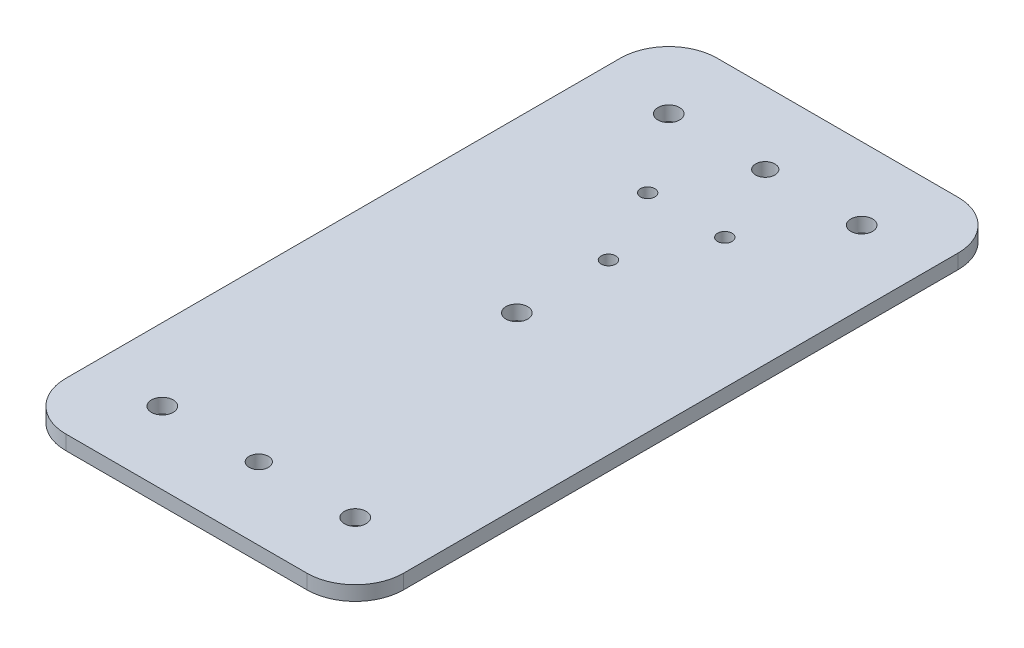
ISO-10303-21;
HEADER;
FILE_DESCRIPTION(('STEP AP214'),'2;1');
FILE_NAME('part.step','',(''),(''),'','','');
FILE_SCHEMA(('AUTOMOTIVE_DESIGN { 1 0 10303 214 1 1 1 1 }'));
ENDSEC;
DATA;
#1=APPLICATION_CONTEXT('core data for automotive mechanical design processes');
#2=APPLICATION_PROTOCOL_DEFINITION('international standard','automotive_design',2000,#1);
#3=PRODUCT_CONTEXT('',#1,'mechanical');
#4=PRODUCT('Part','Part','',(#3));
#5=PRODUCT_RELATED_PRODUCT_CATEGORY('part','',(#4));
#6=PRODUCT_DEFINITION_FORMATION('','',#4);
#7=PRODUCT_DEFINITION_CONTEXT('part definition',#1,'design');
#8=PRODUCT_DEFINITION('design','',#6,#7);
#9=PRODUCT_DEFINITION_SHAPE('','',#8);
#10=(LENGTH_UNIT() NAMED_UNIT(*) SI_UNIT(.MILLI.,.METRE.));
#11=(NAMED_UNIT(*) PLANE_ANGLE_UNIT() SI_UNIT($,.RADIAN.));
#12=(NAMED_UNIT(*) SI_UNIT($,.STERADIAN.) SOLID_ANGLE_UNIT());
#13=UNCERTAINTY_MEASURE_WITH_UNIT(LENGTH_MEASURE(1.E-05),#10,'distance_accuracy_value','');
#14=(GEOMETRIC_REPRESENTATION_CONTEXT(3) GLOBAL_UNCERTAINTY_ASSIGNED_CONTEXT((#13)) GLOBAL_UNIT_ASSIGNED_CONTEXT((#10,
#11,#12)) REPRESENTATION_CONTEXT('',''));
#15=CARTESIAN_POINT('',(0.,0.,0.));
#16=DIRECTION('',(0.,0.,1.));
#17=DIRECTION('',(1.,0.,0.));
#18=AXIS2_PLACEMENT_3D('',#15,#16,#17);
#19=CARTESIAN_POINT('',(0.,3.,0.));
#20=DIRECTION('',(1.,0.,0.));
#21=DIRECTION('',(0.,0.,-1.));
#22=AXIS2_PLACEMENT_3D('',#19,#20,#21);
#23=PLANE('',#22);
#24=DIRECTION('',(0.,0.,1.));
#25=VECTOR('',#24,1.);
#26=CARTESIAN_POINT('',(0.,0.,0.));
#27=LINE('',#26,#25);
#28=CARTESIAN_POINT('',(0.,0.,10.));
#29=VERTEX_POINT('',#28);
#30=CARTESIAN_POINT('',(0.,0.,125.));
#31=VERTEX_POINT('',#30);
#32=EDGE_CURVE('E141',#29,#31,#27,.T.);
#33=ORIENTED_EDGE('',*,*,#32,.T.);
#34=DIRECTION('',(0.,-1.,0.));
#35=VECTOR('',#34,1.);
#36=CARTESIAN_POINT('',(0.,3.,125.));
#37=LINE('',#36,#35);
#38=CARTESIAN_POINT('',(0.,3.,125.));
#39=VERTEX_POINT('',#38);
#40=EDGE_CURVE('E175',#31,#39,#37,.F.);
#41=ORIENTED_EDGE('',*,*,#40,.T.);
#42=DIRECTION('',(0.,0.,1.));
#43=VECTOR('',#42,1.);
#44=CARTESIAN_POINT('',(0.,3.,0.));
#45=LINE('',#44,#43);
#46=CARTESIAN_POINT('',(0.,3.,10.));
#47=VERTEX_POINT('',#46);
#48=EDGE_CURVE('E139',#47,#39,#45,.T.);
#49=ORIENTED_EDGE('',*,*,#48,.F.);
#50=DIRECTION('',(0.,-1.,0.));
#51=VECTOR('',#50,1.);
#52=CARTESIAN_POINT('',(0.,3.,10.));
#53=LINE('',#52,#51);
#54=EDGE_CURVE('E171',#47,#29,#53,.T.);
#55=ORIENTED_EDGE('',*,*,#54,.T.);
#56=EDGE_LOOP('',(#33,#41,#49,#55));
#57=FACE_BOUND('',#56,.T.);
#58=ADVANCED_FACE('F39',(#57),#23,.F.);
#59=CARTESIAN_POINT('',(0.,3.,135.));
#60=DIRECTION('',(0.,0.,-1.));
#61=DIRECTION('',(-1.,0.,0.));
#62=AXIS2_PLACEMENT_3D('',#59,#60,#61);
#63=PLANE('',#62);
#64=DIRECTION('',(1.,0.,0.));
#65=VECTOR('',#64,1.);
#66=CARTESIAN_POINT('',(0.,0.,135.));
#67=LINE('',#66,#65);
#68=CARTESIAN_POINT('',(10.,0.,135.));
#69=VERTEX_POINT('',#68);
#70=CARTESIAN_POINT('',(60.,0.,135.));
#71=VERTEX_POINT('',#70);
#72=EDGE_CURVE('E134',#69,#71,#67,.T.);
#73=ORIENTED_EDGE('',*,*,#72,.T.);
#74=DIRECTION('',(0.,-1.,0.));
#75=VECTOR('',#74,1.);
#76=CARTESIAN_POINT('',(60.,3.,135.));
#77=LINE('',#76,#75);
#78=CARTESIAN_POINT('',(60.,3.,135.));
#79=VERTEX_POINT('',#78);
#80=EDGE_CURVE('E110',#71,#79,#77,.F.);
#81=ORIENTED_EDGE('',*,*,#80,.T.);
#82=DIRECTION('',(1.,0.,0.));
#83=VECTOR('',#82,1.);
#84=CARTESIAN_POINT('',(0.,3.,135.));
#85=LINE('',#84,#83);
#86=CARTESIAN_POINT('',(10.,3.,135.));
#87=VERTEX_POINT('',#86);
#88=EDGE_CURVE('E195',#87,#79,#85,.T.);
#89=ORIENTED_EDGE('',*,*,#88,.F.);
#90=DIRECTION('',(0.,-1.,0.));
#91=VECTOR('',#90,1.);
#92=CARTESIAN_POINT('',(10.,3.,135.));
#93=LINE('',#92,#91);
#94=EDGE_CURVE('E116',#87,#69,#93,.T.);
#95=ORIENTED_EDGE('',*,*,#94,.T.);
#96=EDGE_LOOP('',(#73,#81,#89,#95));
#97=FACE_BOUND('',#96,.T.);
#98=ADVANCED_FACE('F336',(#97),#63,.F.);
#99=CARTESIAN_POINT('',(70.,3.,0.));
#100=DIRECTION('',(-1.,0.,0.));
#101=DIRECTION('',(0.,0.,1.));
#102=AXIS2_PLACEMENT_3D('',#99,#100,#101);
#103=PLANE('',#102);
#104=DIRECTION('',(0.,0.,-1.));
#105=VECTOR('',#104,1.);
#106=CARTESIAN_POINT('',(70.,3.,0.));
#107=LINE('',#106,#105);
#108=CARTESIAN_POINT('',(70.,3.,125.));
#109=VERTEX_POINT('',#108);
#110=CARTESIAN_POINT('',(70.,3.,10.));
#111=VERTEX_POINT('',#110);
#112=EDGE_CURVE('E125',#109,#111,#107,.T.);
#113=ORIENTED_EDGE('',*,*,#112,.F.);
#114=DIRECTION('',(0.,-1.,0.));
#115=VECTOR('',#114,1.);
#116=CARTESIAN_POINT('',(70.,3.,125.));
#117=LINE('',#116,#115);
#118=CARTESIAN_POINT('',(70.,0.,125.));
#119=VERTEX_POINT('',#118);
#120=EDGE_CURVE('E109',#109,#119,#117,.T.);
#121=ORIENTED_EDGE('',*,*,#120,.T.);
#122=DIRECTION('',(0.,0.,-1.));
#123=VECTOR('',#122,1.);
#124=CARTESIAN_POINT('',(70.,0.,0.));
#125=LINE('',#124,#123);
#126=CARTESIAN_POINT('',(70.,0.,10.));
#127=VERTEX_POINT('',#126);
#128=EDGE_CURVE('E123',#119,#127,#125,.T.);
#129=ORIENTED_EDGE('',*,*,#128,.T.);
#130=DIRECTION('',(0.,-1.,0.));
#131=VECTOR('',#130,1.);
#132=CARTESIAN_POINT('',(70.,3.,10.));
#133=LINE('',#132,#131);
#134=EDGE_CURVE('E128',#127,#111,#133,.F.);
#135=ORIENTED_EDGE('',*,*,#134,.T.);
#136=EDGE_LOOP('',(#113,#121,#129,#135));
#137=FACE_BOUND('',#136,.T.);
#138=ADVANCED_FACE('F122',(#137),#103,.F.);
#139=CARTESIAN_POINT('',(0.,3.,0.));
#140=DIRECTION('',(0.,0.,1.));
#141=DIRECTION('',(1.,0.,0.));
#142=AXIS2_PLACEMENT_3D('',#139,#140,#141);
#143=PLANE('',#142);
#144=DIRECTION('',(-1.,0.,0.));
#145=VECTOR('',#144,1.);
#146=CARTESIAN_POINT('',(0.,0.,0.));
#147=LINE('',#146,#145);
#148=CARTESIAN_POINT('',(60.,0.,0.));
#149=VERTEX_POINT('',#148);
#150=CARTESIAN_POINT('',(10.,0.,0.));
#151=VERTEX_POINT('',#150);
#152=EDGE_CURVE('E133',#149,#151,#147,.T.);
#153=ORIENTED_EDGE('',*,*,#152,.T.);
#154=DIRECTION('',(0.,-1.,0.));
#155=VECTOR('',#154,1.);
#156=CARTESIAN_POINT('',(10.,3.,0.));
#157=LINE('',#156,#155);
#158=CARTESIAN_POINT('',(10.,3.,0.));
#159=VERTEX_POINT('',#158);
#160=EDGE_CURVE('E11',#151,#159,#157,.F.);
#161=ORIENTED_EDGE('',*,*,#160,.T.);
#162=DIRECTION('',(-1.,0.,0.));
#163=VECTOR('',#162,1.);
#164=CARTESIAN_POINT('',(0.,3.,0.));
#165=LINE('',#164,#163);
#166=CARTESIAN_POINT('',(60.,3.,0.));
#167=VERTEX_POINT('',#166);
#168=EDGE_CURVE('E146',#167,#159,#165,.T.);
#169=ORIENTED_EDGE('',*,*,#168,.F.);
#170=DIRECTION('',(0.,-1.,0.));
#171=VECTOR('',#170,1.);
#172=CARTESIAN_POINT('',(60.,3.,0.));
#173=LINE('',#172,#171);
#174=EDGE_CURVE('E48',#167,#149,#173,.T.);
#175=ORIENTED_EDGE('',*,*,#174,.T.);
#176=EDGE_LOOP('',(#153,#161,#169,#175));
#177=FACE_BOUND('',#176,.T.);
#178=ADVANCED_FACE('F181',(#177),#143,.F.);
#179=CARTESIAN_POINT('',(0.,3.,0.));
#180=DIRECTION('',(0.,1.,0.));
#181=DIRECTION('',(0.,0.,1.));
#182=AXIS2_PLACEMENT_3D('',#179,#180,#181);
#183=PLANE('',#182);
#184=CARTESIAN_POINT('',(35.,3.,66.5));
#185=DIRECTION('',(0.,-1.,0.));
#186=DIRECTION('',(0.,0.,-1.));
#187=AXIS2_PLACEMENT_3D('',#184,#185,#186);
#188=CIRCLE('',#187,2.25000000009542);
#189=CARTESIAN_POINT('',(35.,3.,64.2499999999045));
#190=VERTEX_POINT('',#189);
#191=EDGE_CURVE('E272',#190,#190,#188,.T.);
#192=ORIENTED_EDGE('',*,*,#191,.T.);
#193=EDGE_LOOP('',(#192));
#194=FACE_BOUND('',#193,.T.);
#195=CARTESIAN_POINT('',(27.,3.,31.3754845034029));
#196=DIRECTION('',(0.,-1.,0.));
#197=DIRECTION('',(0.,0.,-1.));
#198=AXIS2_PLACEMENT_3D('',#195,#196,#197);
#199=CIRCLE('',#198,1.5);
#200=CARTESIAN_POINT('',(27.,3.,29.8754845034029));
#201=VERTEX_POINT('',#200);
#202=EDGE_CURVE('E280',#201,#201,#199,.T.);
#203=ORIENTED_EDGE('',*,*,#202,.T.);
#204=EDGE_LOOP('',(#203));
#205=FACE_BOUND('',#204,.T.);
#206=CARTESIAN_POINT('',(43.,3.,31.3754845034029));
#207=DIRECTION('',(0.,-1.,0.));
#208=DIRECTION('',(0.,0.,-1.));
#209=AXIS2_PLACEMENT_3D('',#206,#207,#208);
#210=CIRCLE('',#209,1.5);
#211=CARTESIAN_POINT('',(43.,3.,29.8754845034029));
#212=VERTEX_POINT('',#211);
#213=EDGE_CURVE('E264',#212,#212,#210,.T.);
#214=ORIENTED_EDGE('',*,*,#213,.T.);
#215=EDGE_LOOP('',(#214));
#216=FACE_BOUND('',#215,.T.);
#217=CARTESIAN_POINT('',(35.,3.,47.5));
#218=DIRECTION('',(0.,-1.,0.));
#219=DIRECTION('',(0.,0.,-1.));
#220=AXIS2_PLACEMENT_3D('',#217,#218,#219);
#221=CIRCLE('',#220,1.50000000009542);
#222=CARTESIAN_POINT('',(35.,3.,45.9999999999045));
#223=VERTEX_POINT('',#222);
#224=EDGE_CURVE('E256',#223,#223,#221,.T.);
#225=ORIENTED_EDGE('',*,*,#224,.T.);
#226=EDGE_LOOP('',(#225));
#227=FACE_BOUND('',#226,.T.);
#228=CARTESIAN_POINT('',(35.,3.,120.));
#229=DIRECTION('',(0.,1.,0.));
#230=DIRECTION('',(0.,0.,1.));
#231=AXIS2_PLACEMENT_3D('',#228,#229,#230);
#232=CIRCLE('',#231,2.);
#233=CARTESIAN_POINT('',(35.,3.,122.));
#234=VERTEX_POINT('',#233);
#235=EDGE_CURVE('E236',#234,#234,#232,.T.);
#236=ORIENTED_EDGE('',*,*,#235,.F.);
#237=EDGE_LOOP('',(#236));
#238=FACE_BOUND('',#237,.T.);
#239=CARTESIAN_POINT('',(55.,3.,120.));
#240=DIRECTION('',(0.,1.,0.));
#241=DIRECTION('',(0.,0.,1.));
#242=AXIS2_PLACEMENT_3D('',#239,#240,#241);
#243=CIRCLE('',#242,2.25);
#244=CARTESIAN_POINT('',(55.,3.,122.25));
#245=VERTEX_POINT('',#244);
#246=EDGE_CURVE('E245',#245,#245,#243,.T.);
#247=ORIENTED_EDGE('',*,*,#246,.F.);
#248=EDGE_LOOP('',(#247));
#249=FACE_BOUND('',#248,.T.);
#250=CARTESIAN_POINT('',(15.,3.,120.));
#251=DIRECTION('',(0.,1.,0.));
#252=DIRECTION('',(0.,0.,1.));
#253=AXIS2_PLACEMENT_3D('',#250,#251,#252);
#254=CIRCLE('',#253,2.25);
#255=CARTESIAN_POINT('',(15.,3.,122.25));
#256=VERTEX_POINT('',#255);
#257=EDGE_CURVE('E220',#256,#256,#254,.T.);
#258=ORIENTED_EDGE('',*,*,#257,.F.);
#259=EDGE_LOOP('',(#258));
#260=FACE_BOUND('',#259,.T.);
#261=CARTESIAN_POINT('',(55.,3.,15.));
#262=DIRECTION('',(0.,1.,0.));
#263=DIRECTION('',(0.,0.,1.));
#264=AXIS2_PLACEMENT_3D('',#261,#262,#263);
#265=CIRCLE('',#264,2.25);
#266=CARTESIAN_POINT('',(55.,3.,17.25));
#267=VERTEX_POINT('',#266);
#268=EDGE_CURVE('E229',#267,#267,#265,.T.);
#269=ORIENTED_EDGE('',*,*,#268,.F.);
#270=EDGE_LOOP('',(#269));
#271=FACE_BOUND('',#270,.T.);
#272=CARTESIAN_POINT('',(35.,3.,15.));
#273=DIRECTION('',(0.,1.,0.));
#274=DIRECTION('',(0.,0.,1.));
#275=AXIS2_PLACEMENT_3D('',#272,#273,#274);
#276=CIRCLE('',#275,2.);
#277=CARTESIAN_POINT('',(35.,3.,17.));
#278=VERTEX_POINT('',#277);
#279=EDGE_CURVE('E252',#278,#278,#276,.T.);
#280=ORIENTED_EDGE('',*,*,#279,.F.);
#281=EDGE_LOOP('',(#280));
#282=FACE_BOUND('',#281,.T.);
#283=CARTESIAN_POINT('',(15.,3.,15.));
#284=DIRECTION('',(0.,1.,0.));
#285=DIRECTION('',(0.,0.,1.));
#286=AXIS2_PLACEMENT_3D('',#283,#284,#285);
#287=CIRCLE('',#286,2.25);
#288=CARTESIAN_POINT('',(15.,3.,17.25));
#289=VERTEX_POINT('',#288);
#290=EDGE_CURVE('E202',#289,#289,#287,.T.);
#291=ORIENTED_EDGE('',*,*,#290,.F.);
#292=EDGE_LOOP('',(#291));
#293=FACE_BOUND('',#292,.T.);
#294=ORIENTED_EDGE('',*,*,#88,.T.);
#295=CARTESIAN_POINT('',(60.,3.,125.));
#296=DIRECTION('',(0.,1.,0.));
#297=DIRECTION('',(0.,0.,1.));
#298=AXIS2_PLACEMENT_3D('',#295,#296,#297);
#299=CIRCLE('',#298,10.);
#300=EDGE_CURVE('E168',#79,#109,#299,.T.);
#301=ORIENTED_EDGE('',*,*,#300,.T.);
#302=ORIENTED_EDGE('',*,*,#112,.T.);
#303=CARTESIAN_POINT('',(60.,3.,10.));
#304=DIRECTION('',(0.,1.,0.));
#305=DIRECTION('',(0.,0.,1.));
#306=AXIS2_PLACEMENT_3D('',#303,#304,#305);
#307=CIRCLE('',#306,10.);
#308=EDGE_CURVE('E60',#111,#167,#307,.T.);
#309=ORIENTED_EDGE('',*,*,#308,.T.);
#310=ORIENTED_EDGE('',*,*,#168,.T.);
#311=CARTESIAN_POINT('',(10.,3.,10.));
#312=DIRECTION('',(0.,1.,0.));
#313=DIRECTION('',(0.,0.,1.));
#314=AXIS2_PLACEMENT_3D('',#311,#312,#313);
#315=CIRCLE('',#314,10.);
#316=EDGE_CURVE('E162',#159,#47,#315,.T.);
#317=ORIENTED_EDGE('',*,*,#316,.T.);
#318=ORIENTED_EDGE('',*,*,#48,.T.);
#319=CARTESIAN_POINT('',(10.,3.,125.));
#320=DIRECTION('',(0.,1.,0.));
#321=DIRECTION('',(0.,0.,1.));
#322=AXIS2_PLACEMENT_3D('',#319,#320,#321);
#323=CIRCLE('',#322,10.);
#324=EDGE_CURVE('E165',#39,#87,#323,.T.);
#325=ORIENTED_EDGE('',*,*,#324,.T.);
#326=EDGE_LOOP('',(#294,#301,#302,#309,#310,#317,#318,#325));
#327=FACE_BOUND('',#326,.T.);
#328=ADVANCED_FACE('F293',(#194,#205,#216,#227,#238,#249,#260,#271,#282,#293,#327),#183,.T.);
#329=CARTESIAN_POINT('',(0.,0.,0.));
#330=DIRECTION('',(0.,1.,0.));
#331=DIRECTION('',(0.,0.,1.));
#332=AXIS2_PLACEMENT_3D('',#329,#330,#331);
#333=PLANE('',#332);
#334=CARTESIAN_POINT('',(35.,0.,66.5));
#335=DIRECTION('',(0.,-1.,0.));
#336=DIRECTION('',(0.,0.,-1.));
#337=AXIS2_PLACEMENT_3D('',#334,#335,#336);
#338=CIRCLE('',#337,2.25000000009542);
#339=CARTESIAN_POINT('',(35.,0.,64.2499999999045));
#340=VERTEX_POINT('',#339);
#341=EDGE_CURVE('E268',#340,#340,#338,.T.);
#342=ORIENTED_EDGE('',*,*,#341,.F.);
#343=EDGE_LOOP('',(#342));
#344=FACE_BOUND('',#343,.T.);
#345=CARTESIAN_POINT('',(27.,0.,31.3754845034029));
#346=DIRECTION('',(0.,-1.,0.));
#347=DIRECTION('',(0.,0.,-1.));
#348=AXIS2_PLACEMENT_3D('',#345,#346,#347);
#349=CIRCLE('',#348,1.5);
#350=CARTESIAN_POINT('',(27.,0.,29.8754845034029));
#351=VERTEX_POINT('',#350);
#352=EDGE_CURVE('E276',#351,#351,#349,.T.);
#353=ORIENTED_EDGE('',*,*,#352,.F.);
#354=EDGE_LOOP('',(#353));
#355=FACE_BOUND('',#354,.T.);
#356=CARTESIAN_POINT('',(43.,0.,31.3754845034029));
#357=DIRECTION('',(0.,-1.,0.));
#358=DIRECTION('',(0.,0.,-1.));
#359=AXIS2_PLACEMENT_3D('',#356,#357,#358);
#360=CIRCLE('',#359,1.5);
#361=CARTESIAN_POINT('',(43.,0.,29.8754845034029));
#362=VERTEX_POINT('',#361);
#363=EDGE_CURVE('E284',#362,#362,#360,.T.);
#364=ORIENTED_EDGE('',*,*,#363,.F.);
#365=EDGE_LOOP('',(#364));
#366=FACE_BOUND('',#365,.T.);
#367=CARTESIAN_POINT('',(35.,0.,47.5));
#368=DIRECTION('',(0.,-1.,0.));
#369=DIRECTION('',(0.,0.,-1.));
#370=AXIS2_PLACEMENT_3D('',#367,#368,#369);
#371=CIRCLE('',#370,1.50000000009542);
#372=CARTESIAN_POINT('',(35.,0.,45.9999999999045));
#373=VERTEX_POINT('',#372);
#374=EDGE_CURVE('E260',#373,#373,#371,.T.);
#375=ORIENTED_EDGE('',*,*,#374,.F.);
#376=EDGE_LOOP('',(#375));
#377=FACE_BOUND('',#376,.T.);
#378=CARTESIAN_POINT('',(35.,0.,120.));
#379=DIRECTION('',(0.,1.,0.));
#380=DIRECTION('',(0.,0.,1.));
#381=AXIS2_PLACEMENT_3D('',#378,#379,#380);
#382=CIRCLE('',#381,2.);
#383=CARTESIAN_POINT('',(35.,0.,122.));
#384=VERTEX_POINT('',#383);
#385=EDGE_CURVE('E240',#384,#384,#382,.T.);
#386=ORIENTED_EDGE('',*,*,#385,.T.);
#387=EDGE_LOOP('',(#386));
#388=FACE_BOUND('',#387,.T.);
#389=CARTESIAN_POINT('',(55.,0.,120.));
#390=DIRECTION('',(0.,1.,0.));
#391=DIRECTION('',(0.,0.,1.));
#392=AXIS2_PLACEMENT_3D('',#389,#390,#391);
#393=CIRCLE('',#392,2.25);
#394=CARTESIAN_POINT('',(55.,0.,122.25));
#395=VERTEX_POINT('',#394);
#396=EDGE_CURVE('E225',#395,#395,#393,.T.);
#397=ORIENTED_EDGE('',*,*,#396,.T.);
#398=EDGE_LOOP('',(#397));
#399=FACE_BOUND('',#398,.T.);
#400=CARTESIAN_POINT('',(15.,0.,120.));
#401=DIRECTION('',(0.,1.,0.));
#402=DIRECTION('',(0.,0.,1.));
#403=AXIS2_PLACEMENT_3D('',#400,#401,#402);
#404=CIRCLE('',#403,2.25);
#405=CARTESIAN_POINT('',(15.,0.,122.25));
#406=VERTEX_POINT('',#405);
#407=EDGE_CURVE('E224',#406,#406,#404,.T.);
#408=ORIENTED_EDGE('',*,*,#407,.T.);
#409=EDGE_LOOP('',(#408));
#410=FACE_BOUND('',#409,.T.);
#411=CARTESIAN_POINT('',(55.,0.,15.));
#412=DIRECTION('',(0.,1.,0.));
#413=DIRECTION('',(0.,0.,1.));
#414=AXIS2_PLACEMENT_3D('',#411,#412,#413);
#415=CIRCLE('',#414,2.25);
#416=CARTESIAN_POINT('',(55.,0.,17.25));
#417=VERTEX_POINT('',#416);
#418=EDGE_CURVE('E218',#417,#417,#415,.T.);
#419=ORIENTED_EDGE('',*,*,#418,.T.);
#420=EDGE_LOOP('',(#419));
#421=FACE_BOUND('',#420,.T.);
#422=CARTESIAN_POINT('',(35.,0.,15.));
#423=DIRECTION('',(0.,1.,0.));
#424=DIRECTION('',(0.,0.,1.));
#425=AXIS2_PLACEMENT_3D('',#422,#423,#424);
#426=CIRCLE('',#425,2.);
#427=CARTESIAN_POINT('',(35.,0.,17.));
#428=VERTEX_POINT('',#427);
#429=EDGE_CURVE('E241',#428,#428,#426,.T.);
#430=ORIENTED_EDGE('',*,*,#429,.T.);
#431=EDGE_LOOP('',(#430));
#432=FACE_BOUND('',#431,.T.);
#433=CARTESIAN_POINT('',(15.,0.,15.));
#434=DIRECTION('',(0.,1.,0.));
#435=DIRECTION('',(0.,0.,1.));
#436=AXIS2_PLACEMENT_3D('',#433,#434,#435);
#437=CIRCLE('',#436,2.25);
#438=CARTESIAN_POINT('',(15.,0.,17.25));
#439=VERTEX_POINT('',#438);
#440=EDGE_CURVE('E209',#439,#439,#437,.T.);
#441=ORIENTED_EDGE('',*,*,#440,.T.);
#442=EDGE_LOOP('',(#441));
#443=FACE_BOUND('',#442,.T.);
#444=ORIENTED_EDGE('',*,*,#128,.F.);
#445=CARTESIAN_POINT('',(60.,0.,125.));
#446=DIRECTION('',(0.,1.,0.));
#447=DIRECTION('',(0.,0.,1.));
#448=AXIS2_PLACEMENT_3D('',#445,#446,#447);
#449=CIRCLE('',#448,10.);
#450=EDGE_CURVE('E105',#119,#71,#449,.F.);
#451=ORIENTED_EDGE('',*,*,#450,.T.);
#452=ORIENTED_EDGE('',*,*,#72,.F.);
#453=CARTESIAN_POINT('',(10.,0.,125.));
#454=DIRECTION('',(0.,1.,0.));
#455=DIRECTION('',(0.,0.,1.));
#456=AXIS2_PLACEMENT_3D('',#453,#454,#455);
#457=CIRCLE('',#456,10.);
#458=EDGE_CURVE('E117',#69,#31,#457,.F.);
#459=ORIENTED_EDGE('',*,*,#458,.T.);
#460=ORIENTED_EDGE('',*,*,#32,.F.);
#461=CARTESIAN_POINT('',(10.,0.,10.));
#462=DIRECTION('',(0.,1.,0.));
#463=DIRECTION('',(0.,0.,1.));
#464=AXIS2_PLACEMENT_3D('',#461,#462,#463);
#465=CIRCLE('',#464,10.);
#466=EDGE_CURVE('E150',#29,#151,#465,.F.);
#467=ORIENTED_EDGE('',*,*,#466,.T.);
#468=ORIENTED_EDGE('',*,*,#152,.F.);
#469=CARTESIAN_POINT('',(60.,0.,10.));
#470=DIRECTION('',(0.,1.,0.));
#471=DIRECTION('',(0.,0.,1.));
#472=AXIS2_PLACEMENT_3D('',#469,#470,#471);
#473=CIRCLE('',#472,10.);
#474=EDGE_CURVE('E127',#149,#127,#473,.F.);
#475=ORIENTED_EDGE('',*,*,#474,.T.);
#476=EDGE_LOOP('',(#444,#451,#452,#459,#460,#467,#468,#475));
#477=FACE_BOUND('',#476,.T.);
#478=ADVANCED_FACE('F130',(#344,#355,#366,#377,#388,#399,#410,#421,#432,#443,#477),#333,.F.);
#479=CARTESIAN_POINT('',(15.,0.,15.));
#480=DIRECTION('',(0.,1.,0.));
#481=DIRECTION('',(0.,0.,1.));
#482=AXIS2_PLACEMENT_3D('',#479,#480,#481);
#483=CYLINDRICAL_SURFACE('',#482,2.25);
#484=ORIENTED_EDGE('',*,*,#440,.F.);
#485=EDGE_LOOP('',(#484));
#486=FACE_BOUND('',#485,.T.);
#487=ORIENTED_EDGE('',*,*,#290,.T.);
#488=EDGE_LOOP('',(#487));
#489=FACE_BOUND('',#488,.T.);
#490=ADVANCED_FACE('F306',(#486,#489),#483,.F.);
#491=CARTESIAN_POINT('',(35.,0.,15.));
#492=DIRECTION('',(0.,1.,0.));
#493=DIRECTION('',(0.,0.,1.));
#494=AXIS2_PLACEMENT_3D('',#491,#492,#493);
#495=CYLINDRICAL_SURFACE('',#494,2.);
#496=ORIENTED_EDGE('',*,*,#429,.F.);
#497=EDGE_LOOP('',(#496));
#498=FACE_BOUND('',#497,.T.);
#499=ORIENTED_EDGE('',*,*,#279,.T.);
#500=EDGE_LOOP('',(#499));
#501=FACE_BOUND('',#500,.T.);
#502=ADVANCED_FACE('F321',(#498,#501),#495,.F.);
#503=CARTESIAN_POINT('',(55.,0.,15.));
#504=DIRECTION('',(0.,1.,0.));
#505=DIRECTION('',(0.,0.,1.));
#506=AXIS2_PLACEMENT_3D('',#503,#504,#505);
#507=CYLINDRICAL_SURFACE('',#506,2.25);
#508=ORIENTED_EDGE('',*,*,#418,.F.);
#509=EDGE_LOOP('',(#508));
#510=FACE_BOUND('',#509,.T.);
#511=ORIENTED_EDGE('',*,*,#268,.T.);
#512=EDGE_LOOP('',(#511));
#513=FACE_BOUND('',#512,.T.);
#514=ADVANCED_FACE('F324',(#510,#513),#507,.F.);
#515=CARTESIAN_POINT('',(15.,0.,120.));
#516=DIRECTION('',(0.,1.,0.));
#517=DIRECTION('',(0.,0.,1.));
#518=AXIS2_PLACEMENT_3D('',#515,#516,#517);
#519=CYLINDRICAL_SURFACE('',#518,2.25);
#520=ORIENTED_EDGE('',*,*,#407,.F.);
#521=EDGE_LOOP('',(#520));
#522=FACE_BOUND('',#521,.T.);
#523=ORIENTED_EDGE('',*,*,#257,.T.);
#524=EDGE_LOOP('',(#523));
#525=FACE_BOUND('',#524,.T.);
#526=ADVANCED_FACE('F361',(#522,#525),#519,.F.);
#527=CARTESIAN_POINT('',(55.,0.,120.));
#528=DIRECTION('',(0.,1.,0.));
#529=DIRECTION('',(0.,0.,1.));
#530=AXIS2_PLACEMENT_3D('',#527,#528,#529);
#531=CYLINDRICAL_SURFACE('',#530,2.25);
#532=ORIENTED_EDGE('',*,*,#396,.F.);
#533=EDGE_LOOP('',(#532));
#534=FACE_BOUND('',#533,.T.);
#535=ORIENTED_EDGE('',*,*,#246,.T.);
#536=EDGE_LOOP('',(#535));
#537=FACE_BOUND('',#536,.T.);
#538=ADVANCED_FACE('F364',(#534,#537),#531,.F.);
#539=CARTESIAN_POINT('',(35.,0.,120.));
#540=DIRECTION('',(0.,1.,0.));
#541=DIRECTION('',(0.,0.,1.));
#542=AXIS2_PLACEMENT_3D('',#539,#540,#541);
#543=CYLINDRICAL_SURFACE('',#542,2.);
#544=ORIENTED_EDGE('',*,*,#385,.F.);
#545=EDGE_LOOP('',(#544));
#546=FACE_BOUND('',#545,.T.);
#547=ORIENTED_EDGE('',*,*,#235,.T.);
#548=EDGE_LOOP('',(#547));
#549=FACE_BOUND('',#548,.T.);
#550=ADVANCED_FACE('F345',(#546,#549),#543,.F.);
#551=CARTESIAN_POINT('',(60.,3.,125.));
#552=DIRECTION('',(0.,-1.,0.));
#553=DIRECTION('',(0.,0.,-1.));
#554=AXIS2_PLACEMENT_3D('',#551,#552,#553);
#555=CYLINDRICAL_SURFACE('',#554,10.);
#556=ORIENTED_EDGE('',*,*,#300,.F.);
#557=ORIENTED_EDGE('',*,*,#80,.F.);
#558=ORIENTED_EDGE('',*,*,#450,.F.);
#559=ORIENTED_EDGE('',*,*,#120,.F.);
#560=EDGE_LOOP('',(#556,#557,#558,#559));
#561=FACE_BOUND('',#560,.T.);
#562=ADVANCED_FACE('F108',(#561),#555,.T.);
#563=CARTESIAN_POINT('',(10.,3.,125.));
#564=DIRECTION('',(0.,-1.,0.));
#565=DIRECTION('',(0.,0.,-1.));
#566=AXIS2_PLACEMENT_3D('',#563,#564,#565);
#567=CYLINDRICAL_SURFACE('',#566,10.);
#568=ORIENTED_EDGE('',*,*,#324,.F.);
#569=ORIENTED_EDGE('',*,*,#40,.F.);
#570=ORIENTED_EDGE('',*,*,#458,.F.);
#571=ORIENTED_EDGE('',*,*,#94,.F.);
#572=EDGE_LOOP('',(#568,#569,#570,#571));
#573=FACE_BOUND('',#572,.T.);
#574=ADVANCED_FACE('F338',(#573),#567,.T.);
#575=CARTESIAN_POINT('',(10.,3.,10.));
#576=DIRECTION('',(0.,-1.,0.));
#577=DIRECTION('',(0.,0.,-1.));
#578=AXIS2_PLACEMENT_3D('',#575,#576,#577);
#579=CYLINDRICAL_SURFACE('',#578,10.);
#580=ORIENTED_EDGE('',*,*,#316,.F.);
#581=ORIENTED_EDGE('',*,*,#160,.F.);
#582=ORIENTED_EDGE('',*,*,#466,.F.);
#583=ORIENTED_EDGE('',*,*,#54,.F.);
#584=EDGE_LOOP('',(#580,#581,#582,#583));
#585=FACE_BOUND('',#584,.T.);
#586=ADVANCED_FACE('F188',(#585),#579,.T.);
#587=CARTESIAN_POINT('',(60.,3.,10.));
#588=DIRECTION('',(0.,-1.,0.));
#589=DIRECTION('',(0.,0.,-1.));
#590=AXIS2_PLACEMENT_3D('',#587,#588,#589);
#591=CYLINDRICAL_SURFACE('',#590,10.);
#592=ORIENTED_EDGE('',*,*,#308,.F.);
#593=ORIENTED_EDGE('',*,*,#134,.F.);
#594=ORIENTED_EDGE('',*,*,#474,.F.);
#595=ORIENTED_EDGE('',*,*,#174,.F.);
#596=EDGE_LOOP('',(#592,#593,#594,#595));
#597=FACE_BOUND('',#596,.T.);
#598=ADVANCED_FACE('F41',(#597),#591,.T.);
#599=CARTESIAN_POINT('',(35.,3.,47.5));
#600=DIRECTION('',(0.,-1.,0.));
#601=DIRECTION('',(0.,0.,-1.));
#602=AXIS2_PLACEMENT_3D('',#599,#600,#601);
#603=CYLINDRICAL_SURFACE('',#602,1.50000000009542);
#604=ORIENTED_EDGE('',*,*,#224,.F.);
#605=EDGE_LOOP('',(#604));
#606=FACE_BOUND('',#605,.T.);
#607=ORIENTED_EDGE('',*,*,#374,.T.);
#608=EDGE_LOOP('',(#607));
#609=FACE_BOUND('',#608,.T.);
#610=ADVANCED_FACE('F300',(#606,#609),#603,.F.);
#611=CARTESIAN_POINT('',(43.,3.,31.3754845034029));
#612=DIRECTION('',(0.,-1.,0.));
#613=DIRECTION('',(0.,0.,-1.));
#614=AXIS2_PLACEMENT_3D('',#611,#612,#613);
#615=CYLINDRICAL_SURFACE('',#614,1.5);
#616=ORIENTED_EDGE('',*,*,#213,.F.);
#617=EDGE_LOOP('',(#616));
#618=FACE_BOUND('',#617,.T.);
#619=ORIENTED_EDGE('',*,*,#363,.T.);
#620=EDGE_LOOP('',(#619));
#621=FACE_BOUND('',#620,.T.);
#622=ADVANCED_FACE('F296',(#618,#621),#615,.F.);
#623=CARTESIAN_POINT('',(27.,3.,31.3754845034029));
#624=DIRECTION('',(0.,-1.,0.));
#625=DIRECTION('',(0.,0.,-1.));
#626=AXIS2_PLACEMENT_3D('',#623,#624,#625);
#627=CYLINDRICAL_SURFACE('',#626,1.5);
#628=ORIENTED_EDGE('',*,*,#202,.F.);
#629=EDGE_LOOP('',(#628));
#630=FACE_BOUND('',#629,.T.);
#631=ORIENTED_EDGE('',*,*,#352,.T.);
#632=EDGE_LOOP('',(#631));
#633=FACE_BOUND('',#632,.T.);
#634=ADVANCED_FACE('F299',(#630,#633),#627,.F.);
#635=CARTESIAN_POINT('',(35.,3.,66.5));
#636=DIRECTION('',(0.,-1.,0.));
#637=DIRECTION('',(0.,0.,-1.));
#638=AXIS2_PLACEMENT_3D('',#635,#636,#637);
#639=CYLINDRICAL_SURFACE('',#638,2.25000000009542);
#640=ORIENTED_EDGE('',*,*,#191,.F.);
#641=EDGE_LOOP('',(#640));
#642=FACE_BOUND('',#641,.T.);
#643=ORIENTED_EDGE('',*,*,#341,.T.);
#644=EDGE_LOOP('',(#643));
#645=FACE_BOUND('',#644,.T.);
#646=ADVANCED_FACE('F378',(#642,#645),#639,.F.);
#647=CLOSED_SHELL('',(#58,#98,#138,#178,#328,#478,#490,#502,#514,#526,#538,#550,#562,#574,#586,
#598,#610,#622,#634,#646));
#648=MANIFOLD_SOLID_BREP('B2',#647);
#649=ADVANCED_BREP_SHAPE_REPRESENTATION('',(#18,#648),#14);
#650=SHAPE_DEFINITION_REPRESENTATION(#9,#649);
ENDSEC;
END-ISO-10303-21;
